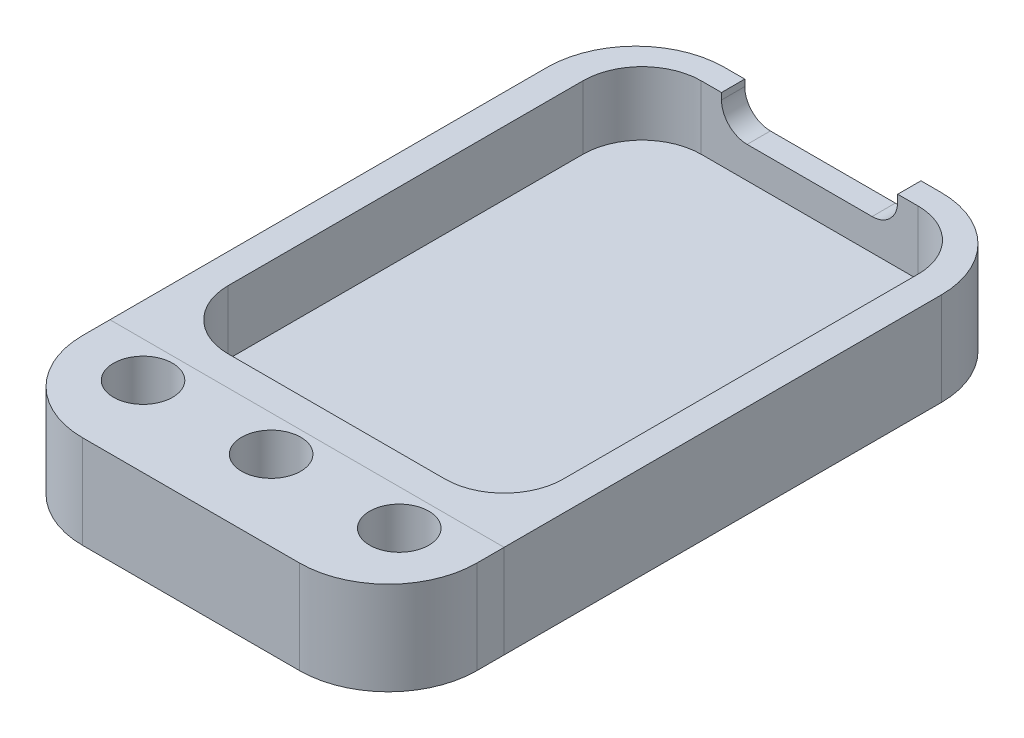
ISO-10303-21;
HEADER;
FILE_DESCRIPTION(('STEP AP214'),'2;1');
FILE_NAME('part.step','',(''),(''),'','','');
FILE_SCHEMA(('AUTOMOTIVE_DESIGN { 1 0 10303 214 1 1 1 1 }'));
ENDSEC;
DATA;
#1=APPLICATION_CONTEXT('core data for automotive mechanical design processes');
#2=APPLICATION_PROTOCOL_DEFINITION('international standard','automotive_design',2000,#1);
#3=PRODUCT_CONTEXT('',#1,'mechanical');
#4=PRODUCT('Part','Part','',(#3));
#5=PRODUCT_RELATED_PRODUCT_CATEGORY('part','',(#4));
#6=PRODUCT_DEFINITION_FORMATION('','',#4);
#7=PRODUCT_DEFINITION_CONTEXT('part definition',#1,'design');
#8=PRODUCT_DEFINITION('design','',#6,#7);
#9=PRODUCT_DEFINITION_SHAPE('','',#8);
#10=(LENGTH_UNIT() NAMED_UNIT(*) SI_UNIT(.MILLI.,.METRE.));
#11=(NAMED_UNIT(*) PLANE_ANGLE_UNIT() SI_UNIT($,.RADIAN.));
#12=(NAMED_UNIT(*) SI_UNIT($,.STERADIAN.) SOLID_ANGLE_UNIT());
#13=UNCERTAINTY_MEASURE_WITH_UNIT(LENGTH_MEASURE(1.E-05),#10,'distance_accuracy_value','');
#14=(GEOMETRIC_REPRESENTATION_CONTEXT(3) GLOBAL_UNCERTAINTY_ASSIGNED_CONTEXT((#13)) GLOBAL_UNIT_ASSIGNED_CONTEXT((#10,
#11,#12)) REPRESENTATION_CONTEXT('',''));
#15=CARTESIAN_POINT('',(0.,0.,0.));
#16=DIRECTION('',(0.,0.,1.));
#17=DIRECTION('',(1.,0.,0.));
#18=AXIS2_PLACEMENT_3D('',#15,#16,#17);
#19=CARTESIAN_POINT('',(-1.5,24.076444987039,1.5));
#20=DIRECTION('',(0.,0.,1.));
#21=DIRECTION('',(1.,0.,0.));
#22=AXIS2_PLACEMENT_3D('',#19,#20,#21);
#23=PLANE('',#22);
#24=DIRECTION('',(-1.,0.,0.));
#25=VECTOR('',#24,1.);
#26=CARTESIAN_POINT('',(-1.5,3.23,1.5));
#27=LINE('',#26,#25);
#28=CARTESIAN_POINT('',(18.5,3.23,1.5));
#29=VERTEX_POINT('',#28);
#30=CARTESIAN_POINT('',(-1.5,3.23,1.5));
#31=VERTEX_POINT('',#30);
#32=EDGE_CURVE('E125',#29,#31,#27,.T.);
#33=ORIENTED_EDGE('',*,*,#32,.F.);
#34=DIRECTION('',(0.,-1.,0.));
#35=VECTOR('',#34,1.);
#36=CARTESIAN_POINT('',(18.5,24.076444987039,1.5));
#37=LINE('',#36,#35);
#38=CARTESIAN_POINT('',(18.5,-1.5,1.5));
#39=VERTEX_POINT('',#38);
#40=EDGE_CURVE('E61',#29,#39,#37,.T.);
#41=ORIENTED_EDGE('',*,*,#40,.T.);
#42=DIRECTION('',(-1.,0.,0.));
#43=VECTOR('',#42,1.);
#44=CARTESIAN_POINT('',(-1.5,-1.5,1.5));
#45=LINE('',#44,#43);
#46=CARTESIAN_POINT('',(-1.5,-1.5,1.5));
#47=VERTEX_POINT('',#46);
#48=EDGE_CURVE('E149',#39,#47,#45,.T.);
#49=ORIENTED_EDGE('',*,*,#48,.T.);
#50=DIRECTION('',(0.,-1.,0.));
#51=VECTOR('',#50,1.);
#52=CARTESIAN_POINT('',(-1.5,24.076444987039,1.5));
#53=LINE('',#52,#51);
#54=EDGE_CURVE('E131',#31,#47,#53,.T.);
#55=ORIENTED_EDGE('',*,*,#54,.F.);
#56=EDGE_LOOP('',(#33,#41,#49,#55));
#57=FACE_BOUND('',#56,.T.);
#58=ADVANCED_FACE('F57',(#57),#23,.F.);
#59=CARTESIAN_POINT('',(-1.5,24.076444987039,2.87998882631971));
#60=DIRECTION('',(1.,0.,0.));
#61=DIRECTION('',(0.,0.,-1.));
#62=AXIS2_PLACEMENT_3D('',#59,#60,#61);
#63=PLANE('',#62);
#64=DIRECTION('',(0.,0.,1.));
#65=VECTOR('',#64,1.);
#66=CARTESIAN_POINT('',(-1.5,3.23,2.87998882631971));
#67=LINE('',#66,#65);
#68=CARTESIAN_POINT('',(-1.5,3.23,2.87998882631971));
#69=VERTEX_POINT('',#68);
#70=EDGE_CURVE('E123',#31,#69,#67,.T.);
#71=ORIENTED_EDGE('',*,*,#70,.F.);
#72=ORIENTED_EDGE('',*,*,#54,.T.);
#73=DIRECTION('',(0.,0.,1.));
#74=VECTOR('',#73,1.);
#75=CARTESIAN_POINT('',(-1.5,-1.5,2.87998882631971));
#76=LINE('',#75,#74);
#77=CARTESIAN_POINT('',(-1.5,-1.5,2.87998882631971));
#78=VERTEX_POINT('',#77);
#79=EDGE_CURVE('E157',#47,#78,#76,.T.);
#80=ORIENTED_EDGE('',*,*,#79,.T.);
#81=DIRECTION('',(0.,-1.,0.));
#82=VECTOR('',#81,1.);
#83=CARTESIAN_POINT('',(-1.5,24.076444987039,2.87998882631971));
#84=LINE('',#83,#82);
#85=EDGE_CURVE('E118',#69,#78,#84,.T.);
#86=ORIENTED_EDGE('',*,*,#85,.F.);
#87=EDGE_LOOP('',(#71,#72,#80,#86));
#88=FACE_BOUND('',#87,.T.);
#89=ADVANCED_FACE('F174',(#88),#63,.F.);
#90=CARTESIAN_POINT('',(3.,24.076444987039,2.87998882631971));
#91=DIRECTION('',(0.,-1.,0.));
#92=DIRECTION('',(0.,0.,-1.));
#93=AXIS2_PLACEMENT_3D('',#90,#91,#92);
#94=CYLINDRICAL_SURFACE('',#93,4.5);
#95=CARTESIAN_POINT('',(3.,3.23,2.87998882631971));
#96=DIRECTION('',(0.,1.,0.));
#97=DIRECTION('',(0.,0.,1.));
#98=AXIS2_PLACEMENT_3D('',#95,#96,#97);
#99=CIRCLE('',#98,4.5);
#100=CARTESIAN_POINT('',(3.00000000000001,3.23,7.37998882631971));
#101=VERTEX_POINT('',#100);
#102=EDGE_CURVE('E109',#69,#101,#99,.T.);
#103=ORIENTED_EDGE('',*,*,#102,.F.);
#104=ORIENTED_EDGE('',*,*,#85,.T.);
#105=CARTESIAN_POINT('',(3.,-1.5,2.87998882631971));
#106=DIRECTION('',(0.,-1.,0.));
#107=DIRECTION('',(0.,0.,-1.));
#108=AXIS2_PLACEMENT_3D('',#105,#106,#107);
#109=CIRCLE('',#108,4.5);
#110=CARTESIAN_POINT('',(3.00000000000001,-1.5,7.37998882631971));
#111=VERTEX_POINT('',#110);
#112=EDGE_CURVE('E117',#78,#111,#109,.F.);
#113=ORIENTED_EDGE('',*,*,#112,.T.);
#114=DIRECTION('',(0.,-1.,0.));
#115=VECTOR('',#114,1.);
#116=CARTESIAN_POINT('',(3.00000000000001,24.076444987039,7.37998882631971));
#117=LINE('',#116,#115);
#118=EDGE_CURVE('E103',#101,#111,#117,.T.);
#119=ORIENTED_EDGE('',*,*,#118,.F.);
#120=EDGE_LOOP('',(#103,#104,#113,#119));
#121=FACE_BOUND('',#120,.T.);
#122=ADVANCED_FACE('F113',(#121),#94,.T.);
#123=CARTESIAN_POINT('',(3.00000000000001,24.076444987039,7.37998882631971));
#124=DIRECTION('',(0.,0.,-1.));
#125=DIRECTION('',(-1.,0.,0.));
#126=AXIS2_PLACEMENT_3D('',#123,#124,#125);
#127=PLANE('',#126);
#128=DIRECTION('',(1.,0.,0.));
#129=VECTOR('',#128,1.);
#130=CARTESIAN_POINT('',(3.00000000000001,3.23,7.37998882631971));
#131=LINE('',#130,#129);
#132=CARTESIAN_POINT('',(14.,3.23,7.37998882631971));
#133=VERTEX_POINT('',#132);
#134=EDGE_CURVE('E66',#101,#133,#131,.T.);
#135=ORIENTED_EDGE('',*,*,#134,.F.);
#136=ORIENTED_EDGE('',*,*,#118,.T.);
#137=DIRECTION('',(1.,0.,0.));
#138=VECTOR('',#137,1.);
#139=CARTESIAN_POINT('',(3.00000000000001,-1.5,7.37998882631971));
#140=LINE('',#139,#138);
#141=CARTESIAN_POINT('',(14.,-1.5,7.37998882631971));
#142=VERTEX_POINT('',#141);
#143=EDGE_CURVE('E152',#111,#142,#140,.T.);
#144=ORIENTED_EDGE('',*,*,#143,.T.);
#145=DIRECTION('',(0.,-1.,0.));
#146=VECTOR('',#145,1.);
#147=CARTESIAN_POINT('',(14.,24.076444987039,7.37998882631971));
#148=LINE('',#147,#146);
#149=EDGE_CURVE('E106',#133,#142,#148,.T.);
#150=ORIENTED_EDGE('',*,*,#149,.F.);
#151=EDGE_LOOP('',(#135,#136,#144,#150));
#152=FACE_BOUND('',#151,.T.);
#153=ADVANCED_FACE('F100',(#152),#127,.F.);
#154=CARTESIAN_POINT('',(14.,24.076444987039,2.87998882631971));
#155=DIRECTION('',(0.,-1.,0.));
#156=DIRECTION('',(0.,0.,-1.));
#157=AXIS2_PLACEMENT_3D('',#154,#155,#156);
#158=CYLINDRICAL_SURFACE('',#157,4.5);
#159=CARTESIAN_POINT('',(14.,3.23,2.87998882631971));
#160=DIRECTION('',(0.,1.,0.));
#161=DIRECTION('',(0.,0.,1.));
#162=AXIS2_PLACEMENT_3D('',#159,#160,#161);
#163=CIRCLE('',#162,4.5);
#164=CARTESIAN_POINT('',(18.5,3.23,2.87998882631971));
#165=VERTEX_POINT('',#164);
#166=EDGE_CURVE('E12',#133,#165,#163,.T.);
#167=ORIENTED_EDGE('',*,*,#166,.F.);
#168=ORIENTED_EDGE('',*,*,#149,.T.);
#169=CARTESIAN_POINT('',(14.,-1.5,2.87998882631971));
#170=DIRECTION('',(0.,-1.,0.));
#171=DIRECTION('',(0.,0.,-1.));
#172=AXIS2_PLACEMENT_3D('',#169,#170,#171);
#173=CIRCLE('',#172,4.5);
#174=CARTESIAN_POINT('',(18.5,-1.5,2.87998882631971));
#175=VERTEX_POINT('',#174);
#176=EDGE_CURVE('E146',#142,#175,#173,.F.);
#177=ORIENTED_EDGE('',*,*,#176,.T.);
#178=DIRECTION('',(0.,-1.,0.));
#179=VECTOR('',#178,1.);
#180=CARTESIAN_POINT('',(18.5,24.076444987039,2.87998882631971));
#181=LINE('',#180,#179);
#182=EDGE_CURVE('E82',#165,#175,#181,.T.);
#183=ORIENTED_EDGE('',*,*,#182,.F.);
#184=EDGE_LOOP('',(#167,#168,#177,#183));
#185=FACE_BOUND('',#184,.T.);
#186=ADVANCED_FACE('F151',(#185),#158,.T.);
#187=CARTESIAN_POINT('',(18.5,24.076444987039,1.5));
#188=DIRECTION('',(-1.,0.,0.));
#189=DIRECTION('',(0.,0.,1.));
#190=AXIS2_PLACEMENT_3D('',#187,#188,#189);
#191=PLANE('',#190);
#192=DIRECTION('',(0.,0.,-1.));
#193=VECTOR('',#192,1.);
#194=CARTESIAN_POINT('',(18.5,3.23,1.5));
#195=LINE('',#194,#193);
#196=EDGE_CURVE('E129',#165,#29,#195,.T.);
#197=ORIENTED_EDGE('',*,*,#196,.F.);
#198=ORIENTED_EDGE('',*,*,#182,.T.);
#199=DIRECTION('',(0.,0.,-1.));
#200=VECTOR('',#199,1.);
#201=CARTESIAN_POINT('',(18.5,-1.5,1.5));
#202=LINE('',#201,#200);
#203=EDGE_CURVE('E139',#175,#39,#202,.T.);
#204=ORIENTED_EDGE('',*,*,#203,.T.);
#205=ORIENTED_EDGE('',*,*,#40,.F.);
#206=EDGE_LOOP('',(#197,#198,#204,#205));
#207=FACE_BOUND('',#206,.T.);
#208=ADVANCED_FACE('F137',(#207),#191,.F.);
#209=CARTESIAN_POINT('',(0.,3.23,0.));
#210=DIRECTION('',(0.,1.,0.));
#211=DIRECTION('',(0.,0.,1.));
#212=AXIS2_PLACEMENT_3D('',#209,#210,#211);
#213=PLANE('',#212);
#214=CARTESIAN_POINT('',(2.,3.23,3.31998882631973));
#215=DIRECTION('',(0.,1.,0.));
#216=DIRECTION('',(0.,0.,1.));
#217=AXIS2_PLACEMENT_3D('',#214,#215,#216);
#218=CIRCLE('',#217,1.5);
#219=CARTESIAN_POINT('',(2.,3.23,4.81998882631973));
#220=VERTEX_POINT('',#219);
#221=EDGE_CURVE('E164',#220,#220,#218,.T.);
#222=ORIENTED_EDGE('',*,*,#221,.F.);
#223=EDGE_LOOP('',(#222));
#224=FACE_BOUND('',#223,.T.);
#225=CARTESIAN_POINT('',(15.,3.23,3.31998882631973));
#226=DIRECTION('',(0.,1.,0.));
#227=DIRECTION('',(0.,0.,-1.));
#228=AXIS2_PLACEMENT_3D('',#225,#226,#227);
#229=CIRCLE('',#228,1.5);
#230=CARTESIAN_POINT('',(15.,3.23,1.81998882631972));
#231=VERTEX_POINT('',#230);
#232=EDGE_CURVE('E221',#231,#231,#229,.T.);
#233=ORIENTED_EDGE('',*,*,#232,.F.);
#234=EDGE_LOOP('',(#233));
#235=FACE_BOUND('',#234,.T.);
#236=CARTESIAN_POINT('',(8.50000000000001,3.23,3.31998882631973));
#237=DIRECTION('',(0.,1.,0.));
#238=DIRECTION('',(0.,0.,1.));
#239=AXIS2_PLACEMENT_3D('',#236,#237,#238);
#240=CIRCLE('',#239,1.5);
#241=CARTESIAN_POINT('',(8.50000000000001,3.23,4.81998882631972));
#242=VERTEX_POINT('',#241);
#243=EDGE_CURVE('E228',#242,#242,#240,.T.);
#244=ORIENTED_EDGE('',*,*,#243,.F.);
#245=EDGE_LOOP('',(#244));
#246=FACE_BOUND('',#245,.T.);
#247=ORIENTED_EDGE('',*,*,#196,.T.);
#248=ORIENTED_EDGE('',*,*,#32,.T.);
#249=ORIENTED_EDGE('',*,*,#70,.T.);
#250=ORIENTED_EDGE('',*,*,#102,.T.);
#251=ORIENTED_EDGE('',*,*,#134,.T.);
#252=ORIENTED_EDGE('',*,*,#166,.T.);
#253=EDGE_LOOP('',(#247,#248,#249,#250,#251,#252));
#254=FACE_BOUND('',#253,.T.);
#255=ADVANCED_FACE('F59',(#224,#235,#246,#254),#213,.T.);
#256=CARTESIAN_POINT('',(0.,-1.5,0.));
#257=DIRECTION('',(0.,-1.,0.));
#258=DIRECTION('',(0.,0.,-1.));
#259=AXIS2_PLACEMENT_3D('',#256,#257,#258);
#260=PLANE('',#259);
#261=ORIENTED_EDGE('',*,*,#48,.F.);
#262=ORIENTED_EDGE('',*,*,#203,.F.);
#263=ORIENTED_EDGE('',*,*,#176,.F.);
#264=ORIENTED_EDGE('',*,*,#143,.F.);
#265=ORIENTED_EDGE('',*,*,#112,.F.);
#266=ORIENTED_EDGE('',*,*,#79,.F.);
#267=EDGE_LOOP('',(#261,#262,#263,#264,#265,#266));
#268=FACE_BOUND('',#267,.T.);
#269=ADVANCED_FACE('F145',(#268),#260,.T.);
#270=CARTESIAN_POINT('',(8.50000000000001,0.23,3.31998882631973));
#271=DIRECTION('',(0.,1.,0.));
#272=DIRECTION('',(0.,0.,1.));
#273=AXIS2_PLACEMENT_3D('',#270,#271,#272);
#274=CYLINDRICAL_SURFACE('',#273,1.5);
#275=CARTESIAN_POINT('',(8.50000000000001,0.23,3.31998882631973));
#276=DIRECTION('',(0.,1.,0.));
#277=DIRECTION('',(0.,0.,1.));
#278=AXIS2_PLACEMENT_3D('',#275,#276,#277);
#279=CIRCLE('',#278,1.5);
#280=CARTESIAN_POINT('',(8.50000000000001,0.23,4.81998882631972));
#281=VERTEX_POINT('',#280);
#282=EDGE_CURVE('E167',#281,#281,#279,.T.);
#283=ORIENTED_EDGE('',*,*,#282,.F.);
#284=EDGE_LOOP('',(#283));
#285=FACE_BOUND('',#284,.T.);
#286=ORIENTED_EDGE('',*,*,#243,.T.);
#287=EDGE_LOOP('',(#286));
#288=FACE_BOUND('',#287,.T.);
#289=ADVANCED_FACE('F191',(#285,#288),#274,.F.);
#290=CARTESIAN_POINT('',(8.50000000000001,0.23,3.31998882631973));
#291=DIRECTION('',(0.,1.,0.));
#292=DIRECTION('',(0.,0.,1.));
#293=AXIS2_PLACEMENT_3D('',#290,#291,#292);
#294=PLANE('',#293);
#295=ORIENTED_EDGE('',*,*,#282,.T.);
#296=EDGE_LOOP('',(#295));
#297=FACE_BOUND('',#296,.T.);
#298=ADVANCED_FACE('F192',(#297),#294,.T.);
#299=CARTESIAN_POINT('',(15.,0.23,3.31998882631973));
#300=DIRECTION('',(0.,1.,0.));
#301=DIRECTION('',(0.,0.,1.));
#302=AXIS2_PLACEMENT_3D('',#299,#300,#301);
#303=CYLINDRICAL_SURFACE('',#302,1.5);
#304=CARTESIAN_POINT('',(15.,0.23,3.31998882631973));
#305=DIRECTION('',(0.,1.,0.));
#306=DIRECTION('',(0.,0.,-1.));
#307=AXIS2_PLACEMENT_3D('',#304,#305,#306);
#308=CIRCLE('',#307,1.5);
#309=CARTESIAN_POINT('',(15.,0.23,1.81998882631972));
#310=VERTEX_POINT('',#309);
#311=EDGE_CURVE('E224',#310,#310,#308,.T.);
#312=ORIENTED_EDGE('',*,*,#311,.F.);
#313=EDGE_LOOP('',(#312));
#314=FACE_BOUND('',#313,.T.);
#315=ORIENTED_EDGE('',*,*,#232,.T.);
#316=EDGE_LOOP('',(#315));
#317=FACE_BOUND('',#316,.T.);
#318=ADVANCED_FACE('F195',(#314,#317),#303,.F.);
#319=CARTESIAN_POINT('',(15.,0.23,3.31998882631973));
#320=DIRECTION('',(0.,-1.,0.));
#321=DIRECTION('',(0.,0.,-1.));
#322=AXIS2_PLACEMENT_3D('',#319,#320,#321);
#323=PLANE('',#322);
#324=ORIENTED_EDGE('',*,*,#311,.T.);
#325=EDGE_LOOP('',(#324));
#326=FACE_BOUND('',#325,.T.);
#327=ADVANCED_FACE('F200',(#326),#323,.F.);
#328=CARTESIAN_POINT('',(2.,0.23,3.31998882631973));
#329=DIRECTION('',(0.,1.,0.));
#330=DIRECTION('',(0.,0.,1.));
#331=AXIS2_PLACEMENT_3D('',#328,#329,#330);
#332=CYLINDRICAL_SURFACE('',#331,1.5);
#333=CARTESIAN_POINT('',(2.,0.23,3.31998882631973));
#334=DIRECTION('',(0.,1.,0.));
#335=DIRECTION('',(0.,0.,1.));
#336=AXIS2_PLACEMENT_3D('',#333,#334,#335);
#337=CIRCLE('',#336,1.5);
#338=CARTESIAN_POINT('',(2.,0.23,4.81998882631973));
#339=VERTEX_POINT('',#338);
#340=EDGE_CURVE('E159',#339,#339,#337,.T.);
#341=ORIENTED_EDGE('',*,*,#340,.F.);
#342=EDGE_LOOP('',(#341));
#343=FACE_BOUND('',#342,.T.);
#344=ORIENTED_EDGE('',*,*,#221,.T.);
#345=EDGE_LOOP('',(#344));
#346=FACE_BOUND('',#345,.T.);
#347=ADVANCED_FACE('F203',(#343,#346),#332,.F.);
#348=CARTESIAN_POINT('',(2.,0.23,3.31998882631973));
#349=DIRECTION('',(0.,1.,0.));
#350=DIRECTION('',(0.,0.,1.));
#351=AXIS2_PLACEMENT_3D('',#348,#349,#350);
#352=PLANE('',#351);
#353=ORIENTED_EDGE('',*,*,#340,.T.);
#354=EDGE_LOOP('',(#353));
#355=FACE_BOUND('',#354,.T.);
#356=ADVANCED_FACE('F210',(#355),#352,.T.);
#357=CLOSED_SHELL('',(#58,#89,#122,#153,#186,#208,#255,#269,#289,#298,#318,#327,#347,#356));
#358=MANIFOLD_SOLID_BREP('B2',#357);
#359=CARTESIAN_POINT('',(0.,3.23,0.));
#360=DIRECTION('',(0.,1.,0.));
#361=DIRECTION('',(0.,0.,1.));
#362=AXIS2_PLACEMENT_3D('',#359,#360,#361);
#363=PLANE('',#362);
#364=DIRECTION('',(-0.99999999999974,0.,-7.20883144670982E-07));
#365=VECTOR('',#364,1.);
#366=CARTESIAN_POINT('',(-1.5,3.23,-25.1800144176629));
#367=LINE('',#366,#365);
#368=CARTESIAN_POINT('',(4.03001815184384,3.23,-25.1800072088184));
#369=VERTEX_POINT('',#368);
#370=CARTESIAN_POINT('',(3.00000162198851,3.23,-25.1800091912589));
#371=VERTEX_POINT('',#370);
#372=EDGE_CURVE('E389',#369,#371,#367,.T.);
#373=ORIENTED_EDGE('',*,*,#372,.T.);
#374=CARTESIAN_POINT('',(3.00000000000001,3.23,-20.6800072088315));
#375=DIRECTION('',(0.,1.,0.));
#376=DIRECTION('',(0.,0.,1.));
#377=AXIS2_PLACEMENT_3D('',#374,#375,#376);
#378=CIRCLE('',#377,4.5);
#379=CARTESIAN_POINT('',(-1.49999999999999,3.23,-20.6800072088315));
#380=VERTEX_POINT('',#379);
#381=EDGE_CURVE('E328',#371,#380,#378,.T.);
#382=ORIENTED_EDGE('',*,*,#381,.T.);
#383=DIRECTION('',(0.,0.,1.));
#384=VECTOR('',#383,1.);
#385=CARTESIAN_POINT('',(-1.5,3.23,-21.));
#386=LINE('',#385,#384);
#387=CARTESIAN_POINT('',(-1.5,3.23,1.5));
#388=VERTEX_POINT('',#387);
#389=EDGE_CURVE('E385',#380,#388,#386,.T.);
#390=ORIENTED_EDGE('',*,*,#389,.T.);
#391=DIRECTION('',(0.99999999999974,0.,-7.20883144692666E-07));
#392=VECTOR('',#391,1.);
#393=CARTESIAN_POINT('',(-1.5,3.23,1.5));
#394=LINE('',#393,#392);
#395=CARTESIAN_POINT('',(18.5,3.23,1.49998558233711));
#396=VERTEX_POINT('',#395);
#397=EDGE_CURVE('E397',#388,#396,#394,.T.);
#398=ORIENTED_EDGE('',*,*,#397,.T.);
#399=DIRECTION('',(0.,0.,-1.));
#400=VECTOR('',#399,1.);
#401=CARTESIAN_POINT('',(18.5,3.23,-25.18));
#402=LINE('',#401,#400);
#403=CARTESIAN_POINT('',(18.5,3.23,-20.6800072088315));
#404=VERTEX_POINT('',#403);
#405=EDGE_CURVE('E737',#396,#404,#402,.T.);
#406=ORIENTED_EDGE('',*,*,#405,.T.);
#407=CARTESIAN_POINT('',(14.,3.23,-20.6800072088315));
#408=DIRECTION('',(0.,1.,0.));
#409=DIRECTION('',(0.,0.,1.));
#410=AXIS2_PLACEMENT_3D('',#407,#408,#409);
#411=CIRCLE('',#410,4.5);
#412=CARTESIAN_POINT('',(14.0000016219857,3.23,-25.1800052264016));
#413=VERTEX_POINT('',#412);
#414=EDGE_CURVE('E377',#413,#404,#411,.F.);
#415=ORIENTED_EDGE('',*,*,#414,.F.);
#416=CARTESIAN_POINT('',(12.9700181518462,3.23,-25.1800072088184));
#417=VERTEX_POINT('',#416);
#418=EDGE_CURVE('E398',#413,#417,#367,.T.);
#419=ORIENTED_EDGE('',*,*,#418,.T.);
#420=DIRECTION('',(-7.20883144670982E-07,0.,0.99999999999974));
#421=VECTOR('',#420,1.);
#422=CARTESIAN_POINT('',(12.9700181544734,3.23,-25.1836516577811));
#423=LINE('',#422,#421);
#424=CARTESIAN_POINT('',(12.9700173011989,3.23,-24.0000000000002));
#425=VERTEX_POINT('',#424);
#426=EDGE_CURVE('E391',#417,#425,#423,.T.);
#427=ORIENTED_EDGE('',*,*,#426,.T.);
#428=DIRECTION('',(-1.,0.,0.));
#429=VECTOR('',#428,1.);
#430=CARTESIAN_POINT('',(3.00000000000003,3.23,-24.));
#431=LINE('',#430,#429);
#432=CARTESIAN_POINT('',(14.,3.23,-24.));
#433=VERTEX_POINT('',#432);
#434=EDGE_CURVE('E765',#433,#425,#431,.T.);
#435=ORIENTED_EDGE('',*,*,#434,.F.);
#436=CARTESIAN_POINT('',(14.,3.23,-21.));
#437=DIRECTION('',(0.,1.,0.));
#438=DIRECTION('',(0.,0.,1.));
#439=AXIS2_PLACEMENT_3D('',#436,#437,#438);
#440=CIRCLE('',#439,3.);
#441=CARTESIAN_POINT('',(17.,3.23,-21.));
#442=VERTEX_POINT('',#441);
#443=EDGE_CURVE('E446',#442,#433,#440,.T.);
#444=ORIENTED_EDGE('',*,*,#443,.F.);
#445=DIRECTION('',(0.,0.,-1.));
#446=VECTOR('',#445,1.);
#447=CARTESIAN_POINT('',(17.,3.23,-3.00000000000002));
#448=LINE('',#447,#446);
#449=CARTESIAN_POINT('',(17.,3.23,-3.00000000000002));
#450=VERTEX_POINT('',#449);
#451=EDGE_CURVE('E681',#450,#442,#448,.T.);
#452=ORIENTED_EDGE('',*,*,#451,.F.);
#453=CARTESIAN_POINT('',(14.,3.23,-3.));
#454=DIRECTION('',(0.,1.,0.));
#455=DIRECTION('',(0.,0.,1.));
#456=AXIS2_PLACEMENT_3D('',#453,#454,#455);
#457=CIRCLE('',#456,3.);
#458=CARTESIAN_POINT('',(14.,3.23,0.));
#459=VERTEX_POINT('',#458);
#460=EDGE_CURVE('E747',#459,#450,#457,.T.);
#461=ORIENTED_EDGE('',*,*,#460,.F.);
#462=DIRECTION('',(1.,0.,0.));
#463=VECTOR('',#462,1.);
#464=CARTESIAN_POINT('',(3.00000000000002,3.23,0.));
#465=LINE('',#464,#463);
#466=CARTESIAN_POINT('',(3.00000000000002,3.23,0.));
#467=VERTEX_POINT('',#466);
#468=EDGE_CURVE('E750',#467,#459,#465,.T.);
#469=ORIENTED_EDGE('',*,*,#468,.F.);
#470=CARTESIAN_POINT('',(3.,3.23,-3.));
#471=DIRECTION('',(0.,1.,0.));
#472=DIRECTION('',(0.,0.,1.));
#473=AXIS2_PLACEMENT_3D('',#470,#471,#472);
#474=CIRCLE('',#473,3.);
#475=CARTESIAN_POINT('',(0.,3.23,-3.00000000000002));
#476=VERTEX_POINT('',#475);
#477=EDGE_CURVE('E753',#476,#467,#474,.T.);
#478=ORIENTED_EDGE('',*,*,#477,.F.);
#479=DIRECTION('',(0.,0.,1.));
#480=VECTOR('',#479,1.);
#481=CARTESIAN_POINT('',(0.,3.23,-3.00000000000002));
#482=LINE('',#481,#480);
#483=CARTESIAN_POINT('',(0.,3.23,-21.));
#484=VERTEX_POINT('',#483);
#485=EDGE_CURVE('E757',#484,#476,#482,.T.);
#486=ORIENTED_EDGE('',*,*,#485,.F.);
#487=CARTESIAN_POINT('',(3.00000000000001,3.23,-21.));
#488=DIRECTION('',(0.,1.,0.));
#489=DIRECTION('',(0.,0.,-1.));
#490=AXIS2_PLACEMENT_3D('',#487,#488,#489);
#491=CIRCLE('',#490,3.);
#492=CARTESIAN_POINT('',(3.00000000000001,3.23,-24.));
#493=VERTEX_POINT('',#492);
#494=EDGE_CURVE('E761',#493,#484,#491,.T.);
#495=ORIENTED_EDGE('',*,*,#494,.F.);
#496=CARTESIAN_POINT('',(4.03001707052144,3.23,-24.));
#497=VERTEX_POINT('',#496);
#498=EDGE_CURVE('E769',#497,#493,#431,.T.);
#499=ORIENTED_EDGE('',*,*,#498,.F.);
#500=DIRECTION('',(-7.20883144670982E-07,0.,0.99999999999974));
#501=VECTOR('',#500,1.);
#502=CARTESIAN_POINT('',(4.03001815447571,3.23,-25.1836581024764));
#503=LINE('',#502,#501);
#504=EDGE_CURVE('E788',#369,#497,#503,.T.);
#505=ORIENTED_EDGE('',*,*,#504,.F.);
#506=EDGE_LOOP('',(#373,#382,#390,#398,#406,#415,#419,#427,#435,#444,#452,#461,#469,#478,#486,
#495,#499,#505));
#507=FACE_BOUND('',#506,.T.);
#508=ADVANCED_FACE('F323',(#507),#363,.T.);
#509=CARTESIAN_POINT('',(-1.5,3.23,-3.00000000000003));
#510=DIRECTION('',(1.,0.,0.));
#511=DIRECTION('',(0.,0.,-1.));
#512=AXIS2_PLACEMENT_3D('',#509,#510,#511);
#513=PLANE('',#512);
#514=DIRECTION('',(0.,1.,0.));
#515=VECTOR('',#514,1.);
#516=CARTESIAN_POINT('',(-1.49999999999999,-1.500025,-20.6800072088315));
#517=LINE('',#516,#515);
#518=CARTESIAN_POINT('',(-1.49999999999999,-1.5,-20.6800072088315));
#519=VERTEX_POINT('',#518);
#520=EDGE_CURVE('E370',#519,#380,#517,.T.);
#521=ORIENTED_EDGE('',*,*,#520,.F.);
#522=DIRECTION('',(0.,0.,1.));
#523=VECTOR('',#522,1.);
#524=CARTESIAN_POINT('',(-1.5,-1.5,-21.));
#525=LINE('',#524,#523);
#526=CARTESIAN_POINT('',(-1.5,-1.5,1.5));
#527=VERTEX_POINT('',#526);
#528=EDGE_CURVE('E657',#519,#527,#525,.T.);
#529=ORIENTED_EDGE('',*,*,#528,.T.);
#530=DIRECTION('',(0.,-1.,0.));
#531=VECTOR('',#530,1.);
#532=CARTESIAN_POINT('',(-1.5,3.23,1.5));
#533=LINE('',#532,#531);
#534=EDGE_CURVE('E394',#388,#527,#533,.T.);
#535=ORIENTED_EDGE('',*,*,#534,.F.);
#536=ORIENTED_EDGE('',*,*,#389,.F.);
#537=EDGE_LOOP('',(#521,#529,#535,#536));
#538=FACE_BOUND('',#537,.T.);
#539=ADVANCED_FACE('F392',(#538),#513,.F.);
#540=CARTESIAN_POINT('',(18.5,3.23,-2.67999999999997));
#541=DIRECTION('',(-1.,0.,0.));
#542=DIRECTION('',(0.,0.,1.));
#543=AXIS2_PLACEMENT_3D('',#540,#541,#542);
#544=PLANE('',#543);
#545=DIRECTION('',(0.,1.,0.));
#546=VECTOR('',#545,1.);
#547=CARTESIAN_POINT('',(18.5,-1.500025,-20.6800072088315));
#548=LINE('',#547,#546);
#549=CARTESIAN_POINT('',(18.5,-1.5,-20.6800072088315));
#550=VERTEX_POINT('',#549);
#551=EDGE_CURVE('E344',#550,#404,#548,.T.);
#552=ORIENTED_EDGE('',*,*,#551,.T.);
#553=ORIENTED_EDGE('',*,*,#405,.F.);
#554=DIRECTION('',(0.,-1.,0.));
#555=VECTOR('',#554,1.);
#556=CARTESIAN_POINT('',(18.5,3.23,1.49998558233711));
#557=LINE('',#556,#555);
#558=CARTESIAN_POINT('',(18.5,-1.5,1.4999855823371));
#559=VERTEX_POINT('',#558);
#560=EDGE_CURVE('E402',#396,#559,#557,.T.);
#561=ORIENTED_EDGE('',*,*,#560,.T.);
#562=DIRECTION('',(0.,0.,-1.));
#563=VECTOR('',#562,1.);
#564=CARTESIAN_POINT('',(18.5,-1.5,-2.67999999999997));
#565=LINE('',#564,#563);
#566=EDGE_CURVE('E444',#559,#550,#565,.T.);
#567=ORIENTED_EDGE('',*,*,#566,.T.);
#568=EDGE_LOOP('',(#552,#553,#561,#567));
#569=FACE_BOUND('',#568,.T.);
#570=ADVANCED_FACE('F459',(#569),#544,.F.);
#571=CARTESIAN_POINT('',(-1.5,-1.5,-25.18));
#572=DIRECTION('',(0.,0.,-1.));
#573=DIRECTION('',(-1.,0.,0.));
#574=AXIS2_PLACEMENT_3D('',#571,#572,#573);
#575=PLANE('',#574);
#576=DIRECTION('',(-1.,0.,0.));
#577=VECTOR('',#576,1.);
#578=CARTESIAN_POINT('',(-1.5,-1.5,-25.18));
#579=LINE('',#578,#577);
#580=CARTESIAN_POINT('',(14.,-1.5,-25.1800036044157));
#581=VERTEX_POINT('',#580);
#582=CARTESIAN_POINT('',(3.00000000000001,-1.5,-25.1800036044157));
#583=VERTEX_POINT('',#582);
#584=EDGE_CURVE('E629',#581,#583,#579,.T.);
#585=ORIENTED_EDGE('',*,*,#584,.T.);
#586=DIRECTION('',(0.,1.,0.));
#587=VECTOR('',#586,1.);
#588=CARTESIAN_POINT('',(3.00000000000001,-1.500025,-25.1800072088315));
#589=LINE('',#588,#587);
#590=CARTESIAN_POINT('',(3.00000000000001,0.,-25.1800072088315));
#591=VERTEX_POINT('',#590);
#592=EDGE_CURVE('E378',#583,#591,#589,.T.);
#593=ORIENTED_EDGE('',*,*,#592,.T.);
#594=CARTESIAN_POINT('',(14.0000000000023,0.,-25.1800032439742));
#595=DIRECTION('',(-0.99999999999974,0.,-7.20883144529425E-07));
#596=VECTOR('',#595,1.);
#597=LINE('',#594,#596);
#598=CARTESIAN_POINT('',(14.,0.,-25.1800072088315));
#599=VERTEX_POINT('',#598);
#600=EDGE_CURVE('E431',#599,#591,#597,.T.);
#601=ORIENTED_EDGE('',*,*,#600,.F.);
#602=DIRECTION('',(0.,1.,0.));
#603=VECTOR('',#602,1.);
#604=CARTESIAN_POINT('',(14.,-1.500025,-25.1800072088315));
#605=LINE('',#604,#603);
#606=EDGE_CURVE('E895',#581,#599,#605,.T.);
#607=ORIENTED_EDGE('',*,*,#606,.F.);
#608=EDGE_LOOP('',(#585,#593,#601,#607));
#609=FACE_BOUND('',#608,.T.);
#610=ADVANCED_FACE('F448',(#609),#575,.T.);
#611=CARTESIAN_POINT('',(0.,-1.5,0.));
#612=DIRECTION('',(0.,-1.,0.));
#613=DIRECTION('',(0.,0.,-1.));
#614=AXIS2_PLACEMENT_3D('',#611,#612,#613);
#615=PLANE('',#614);
#616=ORIENTED_EDGE('',*,*,#528,.F.);
#617=CARTESIAN_POINT('',(3.00000000000001,-1.5,-20.6800072088315));
#618=DIRECTION('',(0.,1.,0.));
#619=DIRECTION('',(0.,0.,1.));
#620=AXIS2_PLACEMENT_3D('',#617,#618,#619);
#621=CIRCLE('',#620,4.5);
#622=EDGE_CURVE('E55',#519,#583,#621,.F.);
#623=ORIENTED_EDGE('',*,*,#622,.T.);
#624=ORIENTED_EDGE('',*,*,#584,.F.);
#625=CARTESIAN_POINT('',(14.,-1.5,-20.6800072088315));
#626=DIRECTION('',(0.,1.,0.));
#627=DIRECTION('',(0.,0.,1.));
#628=AXIS2_PLACEMENT_3D('',#625,#626,#627);
#629=CIRCLE('',#628,4.5);
#630=EDGE_CURVE('E335',#550,#581,#629,.T.);
#631=ORIENTED_EDGE('',*,*,#630,.F.);
#632=ORIENTED_EDGE('',*,*,#566,.F.);
#633=DIRECTION('',(0.99999999999974,0.,-7.2088314503961E-07));
#634=VECTOR('',#633,1.);
#635=CARTESIAN_POINT('',(-1.5,-1.5,1.5));
#636=LINE('',#635,#634);
#637=EDGE_CURVE('E659',#527,#559,#636,.T.);
#638=ORIENTED_EDGE('',*,*,#637,.F.);
#639=EDGE_LOOP('',(#616,#623,#624,#631,#632,#638));
#640=FACE_BOUND('',#639,.T.);
#641=ADVANCED_FACE('F458',(#640),#615,.T.);
#642=CARTESIAN_POINT('',(-1.5,3.23,-25.1800144176629));
#643=DIRECTION('',(-7.20883144670982E-07,0.,0.99999999999974));
#644=DIRECTION('',(0.99999999999974,0.,7.20883144670982E-07));
#645=AXIS2_PLACEMENT_3D('',#642,#643,#644);
#646=PLANE('',#645);
#647=ORIENTED_EDGE('',*,*,#600,.T.);
#648=EDGE_CURVE('E795',#591,#371,#589,.T.);
#649=ORIENTED_EDGE('',*,*,#648,.T.);
#650=ORIENTED_EDGE('',*,*,#372,.F.);
#651=DIRECTION('',(0.,1.,0.));
#652=VECTOR('',#651,1.);
#653=CARTESIAN_POINT('',(4.03001815184616,3.23,-25.180010431166));
#654=LINE('',#653,#652);
#655=CARTESIAN_POINT('',(4.03001815184616,2.9,-25.180010431166));
#656=VERTEX_POINT('',#655);
#657=EDGE_CURVE('E640',#656,#369,#654,.T.);
#658=ORIENTED_EDGE('',*,*,#657,.F.);
#659=CARTESIAN_POINT('',(5.33001815184582,2.9,-25.1800094940179));
#660=DIRECTION('',(-7.20883144670982E-07,0.,0.99999999999974));
#661=DIRECTION('',(0.99999999999974,0.,7.20883144670982E-07));
#662=AXIS2_PLACEMENT_3D('',#659,#660,#661);
#663=CIRCLE('',#662,1.3);
#664=CARTESIAN_POINT('',(5.33001815184582,1.6,-25.1800094940175));
#665=VERTEX_POINT('',#664);
#666=EDGE_CURVE('E650',#665,#656,#663,.F.);
#667=ORIENTED_EDGE('',*,*,#666,.F.);
#668=DIRECTION('',(-0.99999999999974,0.,-7.20883144670982E-07));
#669=VECTOR('',#668,1.);
#670=CARTESIAN_POINT('',(-1.5,1.6,-25.1800144176629));
#671=LINE('',#670,#669);
#672=CARTESIAN_POINT('',(11.6700181518458,1.6,-25.1800072088184));
#673=VERTEX_POINT('',#672);
#674=EDGE_CURVE('E646',#673,#665,#671,.T.);
#675=ORIENTED_EDGE('',*,*,#674,.F.);
#676=CARTESIAN_POINT('',(11.6700181518442,2.9,-25.1800049236188));
#677=DIRECTION('',(-7.20883144670982E-07,0.,0.99999999999974));
#678=DIRECTION('',(0.99999999999974,0.,7.20883144670982E-07));
#679=AXIS2_PLACEMENT_3D('',#676,#677,#678);
#680=CIRCLE('',#679,1.3);
#681=CARTESIAN_POINT('',(12.9700181518445,2.9,-25.1800049236184));
#682=VERTEX_POINT('',#681);
#683=EDGE_CURVE('E630',#682,#673,#680,.F.);
#684=ORIENTED_EDGE('',*,*,#683,.F.);
#685=DIRECTION('',(0.,-1.,0.));
#686=VECTOR('',#685,1.);
#687=CARTESIAN_POINT('',(12.9700181518438,3.22999999999985,-25.1800039864707));
#688=LINE('',#687,#686);
#689=EDGE_CURVE('E616',#417,#682,#688,.T.);
#690=ORIENTED_EDGE('',*,*,#689,.F.);
#691=ORIENTED_EDGE('',*,*,#418,.F.);
#692=EDGE_CURVE('E898',#599,#413,#605,.T.);
#693=ORIENTED_EDGE('',*,*,#692,.F.);
#694=EDGE_LOOP('',(#647,#649,#650,#658,#667,#675,#684,#690,#691,#693));
#695=FACE_BOUND('',#694,.T.);
#696=ADVANCED_FACE('F325',(#695),#646,.F.);
#697=CARTESIAN_POINT('',(3.00000000000003,3.23,-24.));
#698=DIRECTION('',(0.,0.,1.));
#699=DIRECTION('',(1.,0.,0.));
#700=AXIS2_PLACEMENT_3D('',#697,#698,#699);
#701=PLANE('',#700);
#702=ORIENTED_EDGE('',*,*,#434,.T.);
#703=DIRECTION('',(0.,-1.,0.));
#704=VECTOR('',#703,1.);
#705=CARTESIAN_POINT('',(12.9700173011989,3.22999999999989,-24.));
#706=LINE('',#705,#704);
#707=CARTESIAN_POINT('',(12.9700173011989,2.9,-23.9999999999999));
#708=VERTEX_POINT('',#707);
#709=EDGE_CURVE('E432',#425,#708,#706,.T.);
#710=ORIENTED_EDGE('',*,*,#709,.T.);
#711=CARTESIAN_POINT('',(11.6700173011985,2.9,-24.));
#712=DIRECTION('',(0.,0.,1.));
#713=DIRECTION('',(1.,0.,0.));
#714=AXIS2_PLACEMENT_3D('',#711,#712,#713);
#715=CIRCLE('',#714,1.3);
#716=CARTESIAN_POINT('',(11.6700173011985,1.6,-24.0000000000002));
#717=VERTEX_POINT('',#716);
#718=EDGE_CURVE('E638',#708,#717,#715,.F.);
#719=ORIENTED_EDGE('',*,*,#718,.T.);
#720=DIRECTION('',(-1.,0.,0.));
#721=VECTOR('',#720,1.);
#722=CARTESIAN_POINT('',(3.00000000000003,1.6,-24.));
#723=LINE('',#722,#721);
#724=CARTESIAN_POINT('',(5.33001730119687,1.6,-24.0000000000002));
#725=VERTEX_POINT('',#724);
#726=EDGE_CURVE('E888',#717,#725,#723,.T.);
#727=ORIENTED_EDGE('',*,*,#726,.T.);
#728=CARTESIAN_POINT('',(5.33001730119687,2.9,-24.));
#729=DIRECTION('',(0.,0.,1.));
#730=DIRECTION('',(1.,0.,0.));
#731=AXIS2_PLACEMENT_3D('',#728,#729,#730);
#732=CIRCLE('',#731,1.3);
#733=CARTESIAN_POINT('',(4.03001730119653,2.9,-24.));
#734=VERTEX_POINT('',#733);
#735=EDGE_CURVE('E871',#725,#734,#732,.F.);
#736=ORIENTED_EDGE('',*,*,#735,.T.);
#737=DIRECTION('',(0.,1.,0.));
#738=VECTOR('',#737,1.);
#739=CARTESIAN_POINT('',(4.03001730119653,3.23,-24.));
#740=LINE('',#739,#738);
#741=EDGE_CURVE('E413',#734,#497,#740,.T.);
#742=ORIENTED_EDGE('',*,*,#741,.T.);
#743=ORIENTED_EDGE('',*,*,#498,.T.);
#744=DIRECTION('',(0.,-1.,0.));
#745=VECTOR('',#744,1.);
#746=CARTESIAN_POINT('',(3.00000000000001,3.23,-24.));
#747=LINE('',#746,#745);
#748=CARTESIAN_POINT('',(3.00000000000001,0.,-24.));
#749=VERTEX_POINT('',#748);
#750=EDGE_CURVE('E730',#493,#749,#747,.T.);
#751=ORIENTED_EDGE('',*,*,#750,.T.);
#752=DIRECTION('',(-1.,0.,0.));
#753=VECTOR('',#752,1.);
#754=CARTESIAN_POINT('',(3.00000000000003,0.,-24.));
#755=LINE('',#754,#753);
#756=CARTESIAN_POINT('',(14.,0.,-24.));
#757=VERTEX_POINT('',#756);
#758=EDGE_CURVE('E671',#757,#749,#755,.T.);
#759=ORIENTED_EDGE('',*,*,#758,.F.);
#760=DIRECTION('',(0.,-1.,0.));
#761=VECTOR('',#760,1.);
#762=CARTESIAN_POINT('',(14.,3.23,-24.));
#763=LINE('',#762,#761);
#764=EDGE_CURVE('E734',#433,#757,#763,.T.);
#765=ORIENTED_EDGE('',*,*,#764,.F.);
#766=EDGE_LOOP('',(#702,#710,#719,#727,#736,#742,#743,#751,#759,#765));
#767=FACE_BOUND('',#766,.T.);
#768=ADVANCED_FACE('F487',(#767),#701,.T.);
#769=CARTESIAN_POINT('',(-1.5,3.23,1.5));
#770=DIRECTION('',(-7.20883144692666E-07,0.,-0.99999999999974));
#771=DIRECTION('',(-0.99999999999974,0.,7.20883144692666E-07));
#772=AXIS2_PLACEMENT_3D('',#769,#770,#771);
#773=PLANE('',#772);
#774=ORIENTED_EDGE('',*,*,#534,.T.);
#775=ORIENTED_EDGE('',*,*,#637,.T.);
#776=ORIENTED_EDGE('',*,*,#560,.F.);
#777=ORIENTED_EDGE('',*,*,#397,.F.);
#778=EDGE_LOOP('',(#774,#775,#776,#777));
#779=FACE_BOUND('',#778,.T.);
#780=ADVANCED_FACE('F490',(#779),#773,.F.);
#781=CARTESIAN_POINT('',(14.,3.23,-21.));
#782=DIRECTION('',(0.,-1.,0.));
#783=DIRECTION('',(0.,0.,-1.));
#784=AXIS2_PLACEMENT_3D('',#781,#782,#783);
#785=CYLINDRICAL_SURFACE('',#784,3.);
#786=CARTESIAN_POINT('',(14.,0.,-21.));
#787=DIRECTION('',(0.,1.,0.));
#788=DIRECTION('',(0.,0.,1.));
#789=AXIS2_PLACEMENT_3D('',#786,#787,#788);
#790=CIRCLE('',#789,3.);
#791=CARTESIAN_POINT('',(17.,0.,-21.));
#792=VERTEX_POINT('',#791);
#793=EDGE_CURVE('E667',#792,#757,#790,.T.);
#794=ORIENTED_EDGE('',*,*,#793,.F.);
#795=DIRECTION('',(0.,-1.,0.));
#796=VECTOR('',#795,1.);
#797=CARTESIAN_POINT('',(17.,3.23,-21.));
#798=LINE('',#797,#796);
#799=EDGE_CURVE('E706',#442,#792,#798,.T.);
#800=ORIENTED_EDGE('',*,*,#799,.F.);
#801=ORIENTED_EDGE('',*,*,#443,.T.);
#802=ORIENTED_EDGE('',*,*,#764,.T.);
#803=EDGE_LOOP('',(#794,#800,#801,#802));
#804=FACE_BOUND('',#803,.T.);
#805=ADVANCED_FACE('F485',(#804),#785,.F.);
#806=CARTESIAN_POINT('',(3.00000000000001,3.23,-21.));
#807=DIRECTION('',(0.,-1.,0.));
#808=DIRECTION('',(0.,0.,-1.));
#809=AXIS2_PLACEMENT_3D('',#806,#807,#808);
#810=CYLINDRICAL_SURFACE('',#809,3.);
#811=CARTESIAN_POINT('',(3.00000000000001,0.,-21.));
#812=DIRECTION('',(0.,1.,0.));
#813=DIRECTION('',(0.,0.,-1.));
#814=AXIS2_PLACEMENT_3D('',#811,#812,#813);
#815=CIRCLE('',#814,3.);
#816=CARTESIAN_POINT('',(0.,0.,-21.));
#817=VERTEX_POINT('',#816);
#818=EDGE_CURVE('E678',#749,#817,#815,.T.);
#819=ORIENTED_EDGE('',*,*,#818,.F.);
#820=ORIENTED_EDGE('',*,*,#750,.F.);
#821=ORIENTED_EDGE('',*,*,#494,.T.);
#822=DIRECTION('',(0.,-1.,0.));
#823=VECTOR('',#822,1.);
#824=CARTESIAN_POINT('',(0.,3.23,-21.));
#825=LINE('',#824,#823);
#826=EDGE_CURVE('E726',#484,#817,#825,.T.);
#827=ORIENTED_EDGE('',*,*,#826,.T.);
#828=EDGE_LOOP('',(#819,#820,#821,#827));
#829=FACE_BOUND('',#828,.T.);
#830=ADVANCED_FACE('F481',(#829),#810,.F.);
#831=CARTESIAN_POINT('',(0.,3.23,-3.00000000000002));
#832=DIRECTION('',(1.,0.,0.));
#833=DIRECTION('',(0.,0.,-1.));
#834=AXIS2_PLACEMENT_3D('',#831,#832,#833);
#835=PLANE('',#834);
#836=DIRECTION('',(0.,0.,1.));
#837=VECTOR('',#836,1.);
#838=CARTESIAN_POINT('',(0.,0.,-3.00000000000002));
#839=LINE('',#838,#837);
#840=CARTESIAN_POINT('',(0.,0.,-3.00000000000002));
#841=VERTEX_POINT('',#840);
#842=EDGE_CURVE('E687',#817,#841,#839,.T.);
#843=ORIENTED_EDGE('',*,*,#842,.F.);
#844=ORIENTED_EDGE('',*,*,#826,.F.);
#845=ORIENTED_EDGE('',*,*,#485,.T.);
#846=DIRECTION('',(0.,-1.,0.));
#847=VECTOR('',#846,1.);
#848=CARTESIAN_POINT('',(0.,3.23,-3.00000000000002));
#849=LINE('',#848,#847);
#850=EDGE_CURVE('E722',#476,#841,#849,.T.);
#851=ORIENTED_EDGE('',*,*,#850,.T.);
#852=EDGE_LOOP('',(#843,#844,#845,#851));
#853=FACE_BOUND('',#852,.T.);
#854=ADVANCED_FACE('F477',(#853),#835,.T.);
#855=CARTESIAN_POINT('',(3.,3.23,-3.));
#856=DIRECTION('',(0.,-1.,0.));
#857=DIRECTION('',(0.,0.,-1.));
#858=AXIS2_PLACEMENT_3D('',#855,#856,#857);
#859=CYLINDRICAL_SURFACE('',#858,3.);
#860=CARTESIAN_POINT('',(3.,0.,-3.));
#861=DIRECTION('',(0.,1.,0.));
#862=DIRECTION('',(0.,0.,1.));
#863=AXIS2_PLACEMENT_3D('',#860,#861,#862);
#864=CIRCLE('',#863,3.);
#865=CARTESIAN_POINT('',(3.00000000000002,0.,0.));
#866=VERTEX_POINT('',#865);
#867=EDGE_CURVE('E691',#841,#866,#864,.T.);
#868=ORIENTED_EDGE('',*,*,#867,.F.);
#869=ORIENTED_EDGE('',*,*,#850,.F.);
#870=ORIENTED_EDGE('',*,*,#477,.T.);
#871=DIRECTION('',(0.,-1.,0.));
#872=VECTOR('',#871,1.);
#873=CARTESIAN_POINT('',(3.00000000000002,3.23,0.));
#874=LINE('',#873,#872);
#875=EDGE_CURVE('E718',#467,#866,#874,.T.);
#876=ORIENTED_EDGE('',*,*,#875,.T.);
#877=EDGE_LOOP('',(#868,#869,#870,#876));
#878=FACE_BOUND('',#877,.T.);
#879=ADVANCED_FACE('F473',(#878),#859,.F.);
#880=CARTESIAN_POINT('',(3.00000000000002,3.23,0.));
#881=DIRECTION('',(0.,0.,-1.));
#882=DIRECTION('',(-1.,0.,0.));
#883=AXIS2_PLACEMENT_3D('',#880,#881,#882);
#884=PLANE('',#883);
#885=DIRECTION('',(1.,0.,0.));
#886=VECTOR('',#885,1.);
#887=CARTESIAN_POINT('',(3.00000000000002,0.,0.));
#888=LINE('',#887,#886);
#889=CARTESIAN_POINT('',(14.,0.,0.));
#890=VERTEX_POINT('',#889);
#891=EDGE_CURVE('E695',#866,#890,#888,.T.);
#892=ORIENTED_EDGE('',*,*,#891,.F.);
#893=ORIENTED_EDGE('',*,*,#875,.F.);
#894=ORIENTED_EDGE('',*,*,#468,.T.);
#895=DIRECTION('',(0.,-1.,0.));
#896=VECTOR('',#895,1.);
#897=CARTESIAN_POINT('',(14.,3.23,0.));
#898=LINE('',#897,#896);
#899=EDGE_CURVE('E714',#459,#890,#898,.T.);
#900=ORIENTED_EDGE('',*,*,#899,.T.);
#901=EDGE_LOOP('',(#892,#893,#894,#900));
#902=FACE_BOUND('',#901,.T.);
#903=ADVANCED_FACE('F469',(#902),#884,.T.);
#904=CARTESIAN_POINT('',(14.,3.23,-3.));
#905=DIRECTION('',(0.,-1.,0.));
#906=DIRECTION('',(0.,0.,-1.));
#907=AXIS2_PLACEMENT_3D('',#904,#905,#906);
#908=CYLINDRICAL_SURFACE('',#907,3.);
#909=CARTESIAN_POINT('',(14.,0.,-3.));
#910=DIRECTION('',(0.,1.,0.));
#911=DIRECTION('',(0.,0.,1.));
#912=AXIS2_PLACEMENT_3D('',#909,#910,#911);
#913=CIRCLE('',#912,3.);
#914=CARTESIAN_POINT('',(17.,0.,-3.00000000000002));
#915=VERTEX_POINT('',#914);
#916=EDGE_CURVE('E699',#890,#915,#913,.T.);
#917=ORIENTED_EDGE('',*,*,#916,.F.);
#918=ORIENTED_EDGE('',*,*,#899,.F.);
#919=ORIENTED_EDGE('',*,*,#460,.T.);
#920=DIRECTION('',(0.,-1.,0.));
#921=VECTOR('',#920,1.);
#922=CARTESIAN_POINT('',(17.,3.23,-3.00000000000002));
#923=LINE('',#922,#921);
#924=EDGE_CURVE('E710',#450,#915,#923,.T.);
#925=ORIENTED_EDGE('',*,*,#924,.T.);
#926=EDGE_LOOP('',(#917,#918,#919,#925));
#927=FACE_BOUND('',#926,.T.);
#928=ADVANCED_FACE('F465',(#927),#908,.F.);
#929=CARTESIAN_POINT('',(17.,3.23,-3.00000000000002));
#930=DIRECTION('',(-1.,0.,0.));
#931=DIRECTION('',(0.,0.,1.));
#932=AXIS2_PLACEMENT_3D('',#929,#930,#931);
#933=PLANE('',#932);
#934=DIRECTION('',(0.,0.,-1.));
#935=VECTOR('',#934,1.);
#936=CARTESIAN_POINT('',(17.,0.,-3.00000000000002));
#937=LINE('',#936,#935);
#938=EDGE_CURVE('E703',#915,#792,#937,.T.);
#939=ORIENTED_EDGE('',*,*,#938,.F.);
#940=ORIENTED_EDGE('',*,*,#924,.F.);
#941=ORIENTED_EDGE('',*,*,#451,.T.);
#942=ORIENTED_EDGE('',*,*,#799,.T.);
#943=EDGE_LOOP('',(#939,#940,#941,#942));
#944=FACE_BOUND('',#943,.T.);
#945=ADVANCED_FACE('F462',(#944),#933,.T.);
#946=CARTESIAN_POINT('',(0.,0.,0.));
#947=DIRECTION('',(0.,-1.,0.));
#948=DIRECTION('',(0.,0.,-1.));
#949=AXIS2_PLACEMENT_3D('',#946,#947,#948);
#950=PLANE('',#949);
#951=ORIENTED_EDGE('',*,*,#938,.T.);
#952=ORIENTED_EDGE('',*,*,#793,.T.);
#953=ORIENTED_EDGE('',*,*,#758,.T.);
#954=ORIENTED_EDGE('',*,*,#818,.T.);
#955=ORIENTED_EDGE('',*,*,#842,.T.);
#956=ORIENTED_EDGE('',*,*,#867,.T.);
#957=ORIENTED_EDGE('',*,*,#891,.T.);
#958=ORIENTED_EDGE('',*,*,#916,.T.);
#959=EDGE_LOOP('',(#951,#952,#953,#954,#955,#956,#957,#958));
#960=FACE_BOUND('',#959,.T.);
#961=ADVANCED_FACE('F460',(#960),#950,.F.);
#962=CARTESIAN_POINT('',(12.9700181544734,3.23,-25.1836516577811));
#963=DIRECTION('',(-0.99999999999974,0.,-7.20883144670982E-07));
#964=DIRECTION('',(-7.20883144670982E-07,0.,0.99999999999974));
#965=AXIS2_PLACEMENT_3D('',#962,#963,#964);
#966=PLANE('',#965);
#967=ORIENTED_EDGE('',*,*,#689,.T.);
#968=DIRECTION('',(-7.20883144670982E-07,0.,0.99999999999974));
#969=VECTOR('',#968,1.);
#970=CARTESIAN_POINT('',(12.9700181544734,2.9,-25.1836516577811));
#971=LINE('',#970,#969);
#972=EDGE_CURVE('E620',#682,#708,#971,.T.);
#973=ORIENTED_EDGE('',*,*,#972,.T.);
#974=ORIENTED_EDGE('',*,*,#709,.F.);
#975=ORIENTED_EDGE('',*,*,#426,.F.);
#976=EDGE_LOOP('',(#967,#973,#974,#975));
#977=FACE_BOUND('',#976,.T.);
#978=ADVANCED_FACE('F603',(#977),#966,.T.);
#979=CARTESIAN_POINT('',(11.6700181544737,2.9,-25.1836525949292));
#980=DIRECTION('',(-7.20883144670982E-07,0.,0.99999999999974));
#981=DIRECTION('',(0.99999999999974,0.,7.20883144670982E-07));
#982=AXIS2_PLACEMENT_3D('',#979,#980,#981);
#983=CYLINDRICAL_SURFACE('',#982,1.3);
#984=ORIENTED_EDGE('',*,*,#683,.T.);
#985=DIRECTION('',(-7.20883144670982E-07,0.,0.99999999999974));
#986=VECTOR('',#985,1.);
#987=CARTESIAN_POINT('',(11.6700181544737,1.6,-25.1836525949292));
#988=LINE('',#987,#986);
#989=EDGE_CURVE('E641',#673,#717,#988,.T.);
#990=ORIENTED_EDGE('',*,*,#989,.T.);
#991=ORIENTED_EDGE('',*,*,#718,.F.);
#992=ORIENTED_EDGE('',*,*,#972,.F.);
#993=EDGE_LOOP('',(#984,#990,#991,#992));
#994=FACE_BOUND('',#993,.T.);
#995=ADVANCED_FACE('F599',(#994),#983,.F.);
#996=CARTESIAN_POINT('',(11.6700181544737,1.6,-25.1836525949292));
#997=DIRECTION('',(0.,1.,0.));
#998=DIRECTION('',(0.,0.,1.));
#999=AXIS2_PLACEMENT_3D('',#996,#997,#998);
#1000=PLANE('',#999);
#1001=ORIENTED_EDGE('',*,*,#674,.T.);
#1002=DIRECTION('',(-7.20883144670982E-07,0.,0.99999999999974));
#1003=VECTOR('',#1002,1.);
#1004=CARTESIAN_POINT('',(5.33001815447537,1.6,-25.1836571653283));
#1005=LINE('',#1004,#1003);
#1006=EDGE_CURVE('E802',#665,#725,#1005,.T.);
#1007=ORIENTED_EDGE('',*,*,#1006,.T.);
#1008=ORIENTED_EDGE('',*,*,#726,.F.);
#1009=ORIENTED_EDGE('',*,*,#989,.F.);
#1010=EDGE_LOOP('',(#1001,#1007,#1008,#1009));
#1011=FACE_BOUND('',#1010,.T.);
#1012=ADVANCED_FACE('F595',(#1011),#1000,.T.);
#1013=CARTESIAN_POINT('',(5.33001815447537,2.9,-25.1836571653283));
#1014=DIRECTION('',(-7.20883144670982E-07,0.,0.99999999999974));
#1015=DIRECTION('',(0.99999999999974,0.,7.20883144670982E-07));
#1016=AXIS2_PLACEMENT_3D('',#1013,#1014,#1015);
#1017=CYLINDRICAL_SURFACE('',#1016,1.3);
#1018=ORIENTED_EDGE('',*,*,#666,.T.);
#1019=DIRECTION('',(-7.20883144670982E-07,0.,0.99999999999974));
#1020=VECTOR('',#1019,1.);
#1021=CARTESIAN_POINT('',(4.03001815447571,2.9,-25.1836581024764));
#1022=LINE('',#1021,#1020);
#1023=EDGE_CURVE('E792',#656,#734,#1022,.T.);
#1024=ORIENTED_EDGE('',*,*,#1023,.T.);
#1025=ORIENTED_EDGE('',*,*,#735,.F.);
#1026=ORIENTED_EDGE('',*,*,#1006,.F.);
#1027=EDGE_LOOP('',(#1018,#1024,#1025,#1026));
#1028=FACE_BOUND('',#1027,.T.);
#1029=ADVANCED_FACE('F591',(#1028),#1017,.F.);
#1030=CARTESIAN_POINT('',(4.03001815447571,3.23,-25.1836581024764));
#1031=DIRECTION('',(0.99999999999974,0.,7.20883144670982E-07));
#1032=DIRECTION('',(7.20883144670982E-07,0.,-0.99999999999974));
#1033=AXIS2_PLACEMENT_3D('',#1030,#1031,#1032);
#1034=PLANE('',#1033);
#1035=ORIENTED_EDGE('',*,*,#657,.T.);
#1036=ORIENTED_EDGE('',*,*,#504,.T.);
#1037=ORIENTED_EDGE('',*,*,#741,.F.);
#1038=ORIENTED_EDGE('',*,*,#1023,.F.);
#1039=EDGE_LOOP('',(#1035,#1036,#1037,#1038));
#1040=FACE_BOUND('',#1039,.T.);
#1041=ADVANCED_FACE('F540',(#1040),#1034,.T.);
#1042=CARTESIAN_POINT('',(14.,-1.500025,-20.6800072088315));
#1043=DIRECTION('',(0.,1.,0.));
#1044=DIRECTION('',(0.,0.,1.));
#1045=AXIS2_PLACEMENT_3D('',#1042,#1043,#1044);
#1046=CYLINDRICAL_SURFACE('',#1045,4.5);
#1047=ORIENTED_EDGE('',*,*,#414,.T.);
#1048=ORIENTED_EDGE('',*,*,#551,.F.);
#1049=ORIENTED_EDGE('',*,*,#630,.T.);
#1050=ORIENTED_EDGE('',*,*,#606,.T.);
#1051=ORIENTED_EDGE('',*,*,#692,.T.);
#1052=EDGE_LOOP('',(#1047,#1048,#1049,#1050,#1051));
#1053=FACE_BOUND('',#1052,.T.);
#1054=ADVANCED_FACE('F536',(#1053),#1046,.T.);
#1055=CARTESIAN_POINT('',(3.00000000000001,-1.500025,-20.6800072088315));
#1056=DIRECTION('',(0.,1.,0.));
#1057=DIRECTION('',(0.,0.,1.));
#1058=AXIS2_PLACEMENT_3D('',#1055,#1056,#1057);
#1059=CYLINDRICAL_SURFACE('',#1058,4.5);
#1060=ORIENTED_EDGE('',*,*,#648,.F.);
#1061=ORIENTED_EDGE('',*,*,#592,.F.);
#1062=ORIENTED_EDGE('',*,*,#622,.F.);
#1063=ORIENTED_EDGE('',*,*,#520,.T.);
#1064=ORIENTED_EDGE('',*,*,#381,.F.);
#1065=EDGE_LOOP('',(#1060,#1061,#1062,#1063,#1064));
#1066=FACE_BOUND('',#1065,.T.);
#1067=ADVANCED_FACE('F371',(#1066),#1059,.T.);
#1068=CLOSED_SHELL('',(#508,#539,#570,#610,#641,#696,#768,#780,#805,#830,#854,#879,#903,#928,
#945,#961,#978,#995,#1012,#1029,#1041,#1054,#1067));
#1069=MANIFOLD_SOLID_BREP('B6',#1068);
#1070=ADVANCED_BREP_SHAPE_REPRESENTATION('',(#18,#358,#1069),#14);
#1071=SHAPE_DEFINITION_REPRESENTATION(#9,#1070);
ENDSEC;
END-ISO-10303-21;
